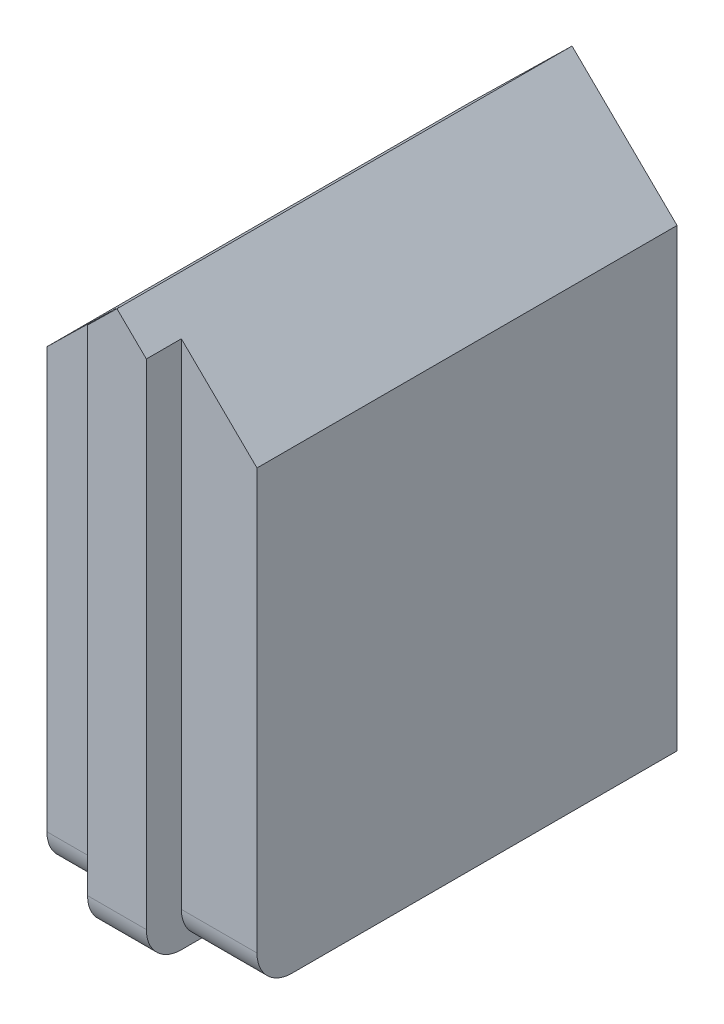
ISO-10303-21;
HEADER;
FILE_DESCRIPTION(('STEP AP214'),'2;1');
FILE_NAME('part.step','',(''),(''),'','','');
FILE_SCHEMA(('AUTOMOTIVE_DESIGN { 1 0 10303 214 1 1 1 1 }'));
ENDSEC;
DATA;
#1=APPLICATION_CONTEXT('core data for automotive mechanical design processes');
#2=APPLICATION_PROTOCOL_DEFINITION('international standard','automotive_design',2000,#1);
#3=PRODUCT_CONTEXT('',#1,'mechanical');
#4=PRODUCT('Part','Part','',(#3));
#5=PRODUCT_RELATED_PRODUCT_CATEGORY('part','',(#4));
#6=PRODUCT_DEFINITION_FORMATION('','',#4);
#7=PRODUCT_DEFINITION_CONTEXT('part definition',#1,'design');
#8=PRODUCT_DEFINITION('design','',#6,#7);
#9=PRODUCT_DEFINITION_SHAPE('','',#8);
#10=(LENGTH_UNIT() NAMED_UNIT(*) SI_UNIT(.MILLI.,.METRE.));
#11=(NAMED_UNIT(*) PLANE_ANGLE_UNIT() SI_UNIT($,.RADIAN.));
#12=(NAMED_UNIT(*) SI_UNIT($,.STERADIAN.) SOLID_ANGLE_UNIT());
#13=UNCERTAINTY_MEASURE_WITH_UNIT(LENGTH_MEASURE(1.E-05),#10,'distance_accuracy_value','');
#14=(GEOMETRIC_REPRESENTATION_CONTEXT(3) GLOBAL_UNCERTAINTY_ASSIGNED_CONTEXT((#13)) GLOBAL_UNIT_ASSIGNED_CONTEXT((#10,
#11,#12)) REPRESENTATION_CONTEXT('',''));
#15=CARTESIAN_POINT('',(0.,0.,0.));
#16=DIRECTION('',(0.,0.,1.));
#17=DIRECTION('',(1.,0.,0.));
#18=AXIS2_PLACEMENT_3D('',#15,#16,#17);
#19=CARTESIAN_POINT('',(3.,1.,12.));
#20=DIRECTION('',(1.,0.,0.));
#21=DIRECTION('',(0.,1.,0.));
#22=AXIS2_PLACEMENT_3D('',#19,#20,#21);
#23=CYLINDRICAL_SURFACE('',#22,1.);
#24=DIRECTION('',(1.,0.,0.));
#25=VECTOR('',#24,1.);
#26=CARTESIAN_POINT('',(3.,1.,13.));
#27=LINE('',#26,#25);
#28=CARTESIAN_POINT('',(2.16002824544881,1.,13.));
#29=VERTEX_POINT('',#28);
#30=CARTESIAN_POINT('',(3.83997175455118,1.,13.));
#31=VERTEX_POINT('',#30);
#32=EDGE_CURVE('E169',#29,#31,#27,.T.);
#33=ORIENTED_EDGE('',*,*,#32,.F.);
#34=CARTESIAN_POINT('',(2.16002824544881,1.,12.));
#35=DIRECTION('',(1.,0.,0.));
#36=DIRECTION('',(0.,0.,-1.));
#37=AXIS2_PLACEMENT_3D('',#34,#35,#36);
#38=CIRCLE('',#37,1.);
#39=CARTESIAN_POINT('',(2.16002824544881,0.,12.));
#40=VERTEX_POINT('',#39);
#41=EDGE_CURVE('E41',#40,#29,#38,.F.);
#42=ORIENTED_EDGE('',*,*,#41,.F.);
#43=DIRECTION('',(1.,0.,0.));
#44=VECTOR('',#43,1.);
#45=CARTESIAN_POINT('',(6.,0.,12.));
#46=LINE('',#45,#44);
#47=CARTESIAN_POINT('',(3.83997175455118,0.,12.));
#48=VERTEX_POINT('',#47);
#49=EDGE_CURVE('E172',#48,#40,#46,.F.);
#50=ORIENTED_EDGE('',*,*,#49,.F.);
#51=CARTESIAN_POINT('',(3.83997175455118,1.,12.));
#52=DIRECTION('',(-1.,0.,0.));
#53=DIRECTION('',(0.,0.,1.));
#54=AXIS2_PLACEMENT_3D('',#51,#52,#53);
#55=CIRCLE('',#54,1.);
#56=EDGE_CURVE('E11',#31,#48,#55,.F.);
#57=ORIENTED_EDGE('',*,*,#56,.F.);
#58=EDGE_LOOP('',(#33,#42,#50,#57));
#59=FACE_BOUND('',#58,.T.);
#60=ADVANCED_FACE('F34',(#59),#23,.T.);
#61=CARTESIAN_POINT('',(0.,1.,11.));
#62=DIRECTION('',(1.,0.,0.));
#63=DIRECTION('',(0.,1.,0.));
#64=AXIS2_PLACEMENT_3D('',#61,#62,#63);
#65=CYLINDRICAL_SURFACE('',#64,1.);
#66=DIRECTION('',(1.,0.,0.));
#67=VECTOR('',#66,1.);
#68=CARTESIAN_POINT('',(0.,1.,12.));
#69=LINE('',#68,#67);
#70=CARTESIAN_POINT('',(3.83997175455118,1.,12.));
#71=VERTEX_POINT('',#70);
#72=CARTESIAN_POINT('',(6.,1.,12.));
#73=VERTEX_POINT('',#72);
#74=EDGE_CURVE('E186',#71,#73,#69,.T.);
#75=ORIENTED_EDGE('',*,*,#74,.F.);
#76=CARTESIAN_POINT('',(3.83997175455118,1.,11.));
#77=DIRECTION('',(-1.,0.,0.));
#78=DIRECTION('',(0.,0.,1.));
#79=AXIS2_PLACEMENT_3D('',#76,#77,#78);
#80=CIRCLE('',#79,1.);
#81=CARTESIAN_POINT('',(3.83997175455118,0.,11.));
#82=VERTEX_POINT('',#81);
#83=EDGE_CURVE('E175',#71,#82,#80,.F.);
#84=ORIENTED_EDGE('',*,*,#83,.T.);
#85=DIRECTION('',(1.,0.,0.));
#86=VECTOR('',#85,1.);
#87=CARTESIAN_POINT('',(6.,0.,11.));
#88=LINE('',#87,#86);
#89=CARTESIAN_POINT('',(6.,0.,11.));
#90=VERTEX_POINT('',#89);
#91=EDGE_CURVE('E182',#90,#82,#88,.F.);
#92=ORIENTED_EDGE('',*,*,#91,.F.);
#93=CARTESIAN_POINT('',(6.,1.,11.));
#94=DIRECTION('',(-1.,0.,0.));
#95=DIRECTION('',(0.,-1.,0.));
#96=AXIS2_PLACEMENT_3D('',#93,#94,#95);
#97=CIRCLE('',#96,1.);
#98=EDGE_CURVE('E177',#73,#90,#97,.F.);
#99=ORIENTED_EDGE('',*,*,#98,.F.);
#100=EDGE_LOOP('',(#75,#84,#92,#99));
#101=FACE_BOUND('',#100,.T.);
#102=ADVANCED_FACE('F267',(#101),#65,.T.);
#103=CARTESIAN_POINT('',(0.,1.,11.));
#104=DIRECTION('',(1.,0.,0.));
#105=DIRECTION('',(0.,1.,0.));
#106=AXIS2_PLACEMENT_3D('',#103,#104,#105);
#107=CYLINDRICAL_SURFACE('',#106,1.);
#108=DIRECTION('',(1.,0.,0.));
#109=VECTOR('',#108,1.);
#110=CARTESIAN_POINT('',(0.,1.,12.));
#111=LINE('',#110,#109);
#112=CARTESIAN_POINT('',(0.,1.,12.));
#113=VERTEX_POINT('',#112);
#114=CARTESIAN_POINT('',(2.16002824544881,1.,12.));
#115=VERTEX_POINT('',#114);
#116=EDGE_CURVE('E165',#113,#115,#111,.T.);
#117=ORIENTED_EDGE('',*,*,#116,.F.);
#118=CARTESIAN_POINT('',(0.,1.,11.));
#119=DIRECTION('',(1.,0.,0.));
#120=DIRECTION('',(0.,1.,0.));
#121=AXIS2_PLACEMENT_3D('',#118,#119,#120);
#122=CIRCLE('',#121,1.);
#123=CARTESIAN_POINT('',(0.,0.,11.));
#124=VERTEX_POINT('',#123);
#125=EDGE_CURVE('E225',#124,#113,#122,.F.);
#126=ORIENTED_EDGE('',*,*,#125,.F.);
#127=DIRECTION('',(1.,0.,0.));
#128=VECTOR('',#127,1.);
#129=CARTESIAN_POINT('',(6.,0.,11.));
#130=LINE('',#129,#128);
#131=CARTESIAN_POINT('',(2.16002824544881,0.,11.));
#132=VERTEX_POINT('',#131);
#133=EDGE_CURVE('E223',#132,#124,#130,.F.);
#134=ORIENTED_EDGE('',*,*,#133,.F.);
#135=CARTESIAN_POINT('',(2.16002824544881,1.,11.));
#136=DIRECTION('',(1.,0.,0.));
#137=DIRECTION('',(0.,0.,-1.));
#138=AXIS2_PLACEMENT_3D('',#135,#136,#137);
#139=CIRCLE('',#138,1.);
#140=EDGE_CURVE('E189',#132,#115,#139,.F.);
#141=ORIENTED_EDGE('',*,*,#140,.T.);
#142=EDGE_LOOP('',(#117,#126,#134,#141));
#143=FACE_BOUND('',#142,.T.);
#144=ADVANCED_FACE('F269',(#143),#107,.T.);
#145=CARTESIAN_POINT('',(0.,0.,12.));
#146=DIRECTION('',(0.,0.,-1.));
#147=DIRECTION('',(-1.,0.,0.));
#148=AXIS2_PLACEMENT_3D('',#145,#146,#147);
#149=PLANE('',#148);
#150=DIRECTION('',(0.,1.,0.));
#151=VECTOR('',#150,1.);
#152=CARTESIAN_POINT('',(3.83997175455118,0.,12.));
#153=LINE('',#152,#151);
#154=CARTESIAN_POINT('',(3.83997175455118,15.1163868125395,12.));
#155=VERTEX_POINT('',#154);
#156=EDGE_CURVE('E138',#71,#155,#153,.T.);
#157=ORIENTED_EDGE('',*,*,#156,.F.);
#158=ORIENTED_EDGE('',*,*,#74,.T.);
#159=DIRECTION('',(0.,1.,0.));
#160=VECTOR('',#159,1.);
#161=CARTESIAN_POINT('',(6.,13.,12.));
#162=LINE('',#161,#160);
#163=CARTESIAN_POINT('',(6.,13.,12.));
#164=VERTEX_POINT('',#163);
#165=EDGE_CURVE('E199',#73,#164,#162,.T.);
#166=ORIENTED_EDGE('',*,*,#165,.T.);
#167=DIRECTION('',(-0.714285714285715,0.699854212223765,0.));
#168=VECTOR('',#167,1.);
#169=CARTESIAN_POINT('',(3.,15.9393876913398,12.));
#170=LINE('',#169,#168);
#171=EDGE_CURVE('E201',#164,#155,#170,.T.);
#172=ORIENTED_EDGE('',*,*,#171,.T.);
#173=EDGE_LOOP('',(#157,#158,#166,#172));
#174=FACE_BOUND('',#173,.T.);
#175=ADVANCED_FACE('F266',(#174),#149,.F.);
#176=DIRECTION('',(0.,-1.,0.));
#177=VECTOR('',#176,1.);
#178=CARTESIAN_POINT('',(0.,0.,12.));
#179=LINE('',#178,#177);
#180=CARTESIAN_POINT('',(0.,13.,12.));
#181=VERTEX_POINT('',#180);
#182=EDGE_CURVE('E213',#181,#113,#179,.T.);
#183=ORIENTED_EDGE('',*,*,#182,.T.);
#184=ORIENTED_EDGE('',*,*,#116,.T.);
#185=DIRECTION('',(0.,-1.,0.));
#186=VECTOR('',#185,1.);
#187=CARTESIAN_POINT('',(2.16002824544881,15.1163868125395,12.));
#188=LINE('',#187,#186);
#189=CARTESIAN_POINT('',(2.16002824544882,15.1163868125395,12.));
#190=VERTEX_POINT('',#189);
#191=EDGE_CURVE('E192',#190,#115,#188,.T.);
#192=ORIENTED_EDGE('',*,*,#191,.F.);
#193=DIRECTION('',(-0.714285714285715,-0.699854212223765,0.));
#194=VECTOR('',#193,1.);
#195=CARTESIAN_POINT('',(0.,13.,12.));
#196=LINE('',#195,#194);
#197=EDGE_CURVE('E143',#190,#181,#196,.T.);
#198=ORIENTED_EDGE('',*,*,#197,.T.);
#199=EDGE_LOOP('',(#183,#184,#192,#198));
#200=FACE_BOUND('',#199,.T.);
#201=ADVANCED_FACE('F219',(#200),#149,.F.);
#202=CARTESIAN_POINT('',(6.,0.,12.));
#203=DIRECTION('',(0.,1.,0.));
#204=DIRECTION('',(-1.,0.,0.));
#205=AXIS2_PLACEMENT_3D('',#202,#203,#204);
#206=PLANE('',#205);
#207=DIRECTION('',(0.,0.,-1.));
#208=VECTOR('',#207,1.);
#209=CARTESIAN_POINT('',(3.83997175455118,0.,13.));
#210=LINE('',#209,#208);
#211=EDGE_CURVE('E150',#48,#82,#210,.T.);
#212=ORIENTED_EDGE('',*,*,#211,.F.);
#213=ORIENTED_EDGE('',*,*,#49,.T.);
#214=DIRECTION('',(0.,0.,-1.));
#215=VECTOR('',#214,1.);
#216=CARTESIAN_POINT('',(2.16002824544881,0.,13.));
#217=LINE('',#216,#215);
#218=EDGE_CURVE('E145',#40,#132,#217,.T.);
#219=ORIENTED_EDGE('',*,*,#218,.T.);
#220=ORIENTED_EDGE('',*,*,#133,.T.);
#221=DIRECTION('',(0.,0.,-1.));
#222=VECTOR('',#221,1.);
#223=CARTESIAN_POINT('',(0.,0.,12.));
#224=LINE('',#223,#222);
#225=CARTESIAN_POINT('',(0.,0.,0.));
#226=VERTEX_POINT('',#225);
#227=EDGE_CURVE('E241',#124,#226,#224,.T.);
#228=ORIENTED_EDGE('',*,*,#227,.T.);
#229=DIRECTION('',(1.,0.,0.));
#230=VECTOR('',#229,1.);
#231=CARTESIAN_POINT('',(6.,0.,0.));
#232=LINE('',#231,#230);
#233=CARTESIAN_POINT('',(6.,0.,0.));
#234=VERTEX_POINT('',#233);
#235=EDGE_CURVE('E144',#226,#234,#232,.T.);
#236=ORIENTED_EDGE('',*,*,#235,.T.);
#237=DIRECTION('',(0.,0.,-1.));
#238=VECTOR('',#237,1.);
#239=CARTESIAN_POINT('',(6.,0.,12.));
#240=LINE('',#239,#238);
#241=EDGE_CURVE('E211',#90,#234,#240,.T.);
#242=ORIENTED_EDGE('',*,*,#241,.F.);
#243=ORIENTED_EDGE('',*,*,#91,.T.);
#244=EDGE_LOOP('',(#212,#213,#219,#220,#228,#236,#242,#243));
#245=FACE_BOUND('',#244,.T.);
#246=ADVANCED_FACE('F256',(#245),#206,.F.);
#247=CARTESIAN_POINT('',(6.,13.,12.));
#248=DIRECTION('',(-1.,0.,0.));
#249=DIRECTION('',(0.,-1.,0.));
#250=AXIS2_PLACEMENT_3D('',#247,#248,#249);
#251=PLANE('',#250);
#252=ORIENTED_EDGE('',*,*,#165,.F.);
#253=ORIENTED_EDGE('',*,*,#98,.T.);
#254=ORIENTED_EDGE('',*,*,#241,.T.);
#255=DIRECTION('',(0.,1.,0.));
#256=VECTOR('',#255,1.);
#257=CARTESIAN_POINT('',(6.,13.,0.));
#258=LINE('',#257,#256);
#259=CARTESIAN_POINT('',(6.,13.,0.));
#260=VERTEX_POINT('',#259);
#261=EDGE_CURVE('E148',#234,#260,#258,.T.);
#262=ORIENTED_EDGE('',*,*,#261,.T.);
#263=DIRECTION('',(0.,0.,-1.));
#264=VECTOR('',#263,1.);
#265=CARTESIAN_POINT('',(6.,13.,12.));
#266=LINE('',#265,#264);
#267=EDGE_CURVE('E226',#164,#260,#266,.T.);
#268=ORIENTED_EDGE('',*,*,#267,.F.);
#269=EDGE_LOOP('',(#252,#253,#254,#262,#268));
#270=FACE_BOUND('',#269,.T.);
#271=ADVANCED_FACE('F250',(#270),#251,.F.);
#272=CARTESIAN_POINT('',(3.,15.9393876913398,12.));
#273=DIRECTION('',(-0.699854212223765,-0.714285714285715,0.));
#274=DIRECTION('',(0.714285714285715,-0.699854212223765,0.));
#275=AXIS2_PLACEMENT_3D('',#272,#273,#274);
#276=PLANE('',#275);
#277=DIRECTION('',(-0.714285714285715,0.699854212223765,0.));
#278=VECTOR('',#277,1.);
#279=CARTESIAN_POINT('',(3.,15.9393876913398,0.));
#280=LINE('',#279,#278);
#281=CARTESIAN_POINT('',(3.,15.9393876913398,0.));
#282=VERTEX_POINT('',#281);
#283=EDGE_CURVE('E247',#260,#282,#280,.T.);
#284=ORIENTED_EDGE('',*,*,#283,.T.);
#285=DIRECTION('',(0.,0.,-1.));
#286=VECTOR('',#285,1.);
#287=CARTESIAN_POINT('',(3.,15.9393876913398,12.));
#288=LINE('',#287,#286);
#289=CARTESIAN_POINT('',(3.,15.9393876913398,13.));
#290=VERTEX_POINT('',#289);
#291=EDGE_CURVE('E231',#290,#282,#288,.T.);
#292=ORIENTED_EDGE('',*,*,#291,.F.);
#293=DIRECTION('',(-0.714285714285714,0.699854212223765,0.));
#294=VECTOR('',#293,1.);
#295=CARTESIAN_POINT('',(3.83997175455118,15.1163868125395,13.));
#296=LINE('',#295,#294);
#297=CARTESIAN_POINT('',(3.83997175455118,15.1163868125395,13.));
#298=VERTEX_POINT('',#297);
#299=EDGE_CURVE('E135',#298,#290,#296,.T.);
#300=ORIENTED_EDGE('',*,*,#299,.F.);
#301=DIRECTION('',(0.,0.,-1.));
#302=VECTOR('',#301,1.);
#303=CARTESIAN_POINT('',(3.83997175455118,15.1163868125395,13.));
#304=LINE('',#303,#302);
#305=EDGE_CURVE('E158',#298,#155,#304,.T.);
#306=ORIENTED_EDGE('',*,*,#305,.T.);
#307=ORIENTED_EDGE('',*,*,#171,.F.);
#308=ORIENTED_EDGE('',*,*,#267,.T.);
#309=EDGE_LOOP('',(#284,#292,#300,#306,#307,#308));
#310=FACE_BOUND('',#309,.T.);
#311=ADVANCED_FACE('F260',(#310),#276,.F.);
#312=CARTESIAN_POINT('',(0.,13.,12.));
#313=DIRECTION('',(0.699854212223765,-0.714285714285714,0.));
#314=DIRECTION('',(0.714285714285715,0.699854212223765,0.));
#315=AXIS2_PLACEMENT_3D('',#312,#313,#314);
#316=PLANE('',#315);
#317=DIRECTION('',(-0.714285714285715,-0.699854212223765,0.));
#318=VECTOR('',#317,1.);
#319=CARTESIAN_POINT('',(0.,13.,0.));
#320=LINE('',#319,#318);
#321=CARTESIAN_POINT('',(0.,13.,0.));
#322=VERTEX_POINT('',#321);
#323=EDGE_CURVE('E245',#282,#322,#320,.T.);
#324=ORIENTED_EDGE('',*,*,#323,.T.);
#325=DIRECTION('',(0.,0.,-1.));
#326=VECTOR('',#325,1.);
#327=CARTESIAN_POINT('',(0.,13.,12.));
#328=LINE('',#327,#326);
#329=EDGE_CURVE('E236',#181,#322,#328,.T.);
#330=ORIENTED_EDGE('',*,*,#329,.F.);
#331=ORIENTED_EDGE('',*,*,#197,.F.);
#332=DIRECTION('',(0.,0.,-1.));
#333=VECTOR('',#332,1.);
#334=CARTESIAN_POINT('',(2.16002824544881,15.1163868125395,13.));
#335=LINE('',#334,#333);
#336=CARTESIAN_POINT('',(2.16002824544881,15.1163868125395,13.));
#337=VERTEX_POINT('',#336);
#338=EDGE_CURVE('E125',#337,#190,#335,.T.);
#339=ORIENTED_EDGE('',*,*,#338,.F.);
#340=DIRECTION('',(-0.714285714285715,-0.699854212223764,0.));
#341=VECTOR('',#340,1.);
#342=CARTESIAN_POINT('',(3.,15.9393876913398,13.));
#343=LINE('',#342,#341);
#344=EDGE_CURVE('E129',#290,#337,#343,.T.);
#345=ORIENTED_EDGE('',*,*,#344,.F.);
#346=ORIENTED_EDGE('',*,*,#291,.T.);
#347=EDGE_LOOP('',(#324,#330,#331,#339,#345,#346));
#348=FACE_BOUND('',#347,.T.);
#349=ADVANCED_FACE('F141',(#348),#316,.F.);
#350=CARTESIAN_POINT('',(0.,0.,12.));
#351=DIRECTION('',(1.,0.,0.));
#352=DIRECTION('',(0.,1.,0.));
#353=AXIS2_PLACEMENT_3D('',#350,#351,#352);
#354=PLANE('',#353);
#355=ORIENTED_EDGE('',*,*,#227,.F.);
#356=ORIENTED_EDGE('',*,*,#125,.T.);
#357=ORIENTED_EDGE('',*,*,#182,.F.);
#358=ORIENTED_EDGE('',*,*,#329,.T.);
#359=DIRECTION('',(0.,-1.,0.));
#360=VECTOR('',#359,1.);
#361=CARTESIAN_POINT('',(0.,0.,0.));
#362=LINE('',#361,#360);
#363=EDGE_CURVE('E202',#322,#226,#362,.T.);
#364=ORIENTED_EDGE('',*,*,#363,.T.);
#365=EDGE_LOOP('',(#355,#356,#357,#358,#364));
#366=FACE_BOUND('',#365,.T.);
#367=ADVANCED_FACE('F259',(#366),#354,.F.);
#368=CARTESIAN_POINT('',(0.,0.,0.));
#369=DIRECTION('',(0.,0.,-1.));
#370=DIRECTION('',(-1.,0.,0.));
#371=AXIS2_PLACEMENT_3D('',#368,#369,#370);
#372=PLANE('',#371);
#373=ORIENTED_EDGE('',*,*,#235,.F.);
#374=ORIENTED_EDGE('',*,*,#363,.F.);
#375=ORIENTED_EDGE('',*,*,#323,.F.);
#376=ORIENTED_EDGE('',*,*,#283,.F.);
#377=ORIENTED_EDGE('',*,*,#261,.F.);
#378=EDGE_LOOP('',(#373,#374,#375,#376,#377));
#379=FACE_BOUND('',#378,.T.);
#380=ADVANCED_FACE('F253',(#379),#372,.T.);
#381=CARTESIAN_POINT('',(2.16002824544881,15.1163868125395,13.));
#382=DIRECTION('',(1.,0.,0.));
#383=DIRECTION('',(0.,0.,-1.));
#384=AXIS2_PLACEMENT_3D('',#381,#382,#383);
#385=PLANE('',#384);
#386=ORIENTED_EDGE('',*,*,#218,.F.);
#387=ORIENTED_EDGE('',*,*,#41,.T.);
#388=DIRECTION('',(0.,-1.,0.));
#389=VECTOR('',#388,1.);
#390=CARTESIAN_POINT('',(2.16002824544881,15.1163868125395,13.));
#391=LINE('',#390,#389);
#392=EDGE_CURVE('E119',#337,#29,#391,.T.);
#393=ORIENTED_EDGE('',*,*,#392,.F.);
#394=ORIENTED_EDGE('',*,*,#338,.T.);
#395=ORIENTED_EDGE('',*,*,#191,.T.);
#396=ORIENTED_EDGE('',*,*,#140,.F.);
#397=EDGE_LOOP('',(#386,#387,#393,#394,#395,#396));
#398=FACE_BOUND('',#397,.T.);
#399=ADVANCED_FACE('F122',(#398),#385,.F.);
#400=CARTESIAN_POINT('',(3.83997175455118,0.,13.));
#401=DIRECTION('',(-1.,0.,0.));
#402=DIRECTION('',(0.,0.,1.));
#403=AXIS2_PLACEMENT_3D('',#400,#401,#402);
#404=PLANE('',#403);
#405=DIRECTION('',(0.,1.,0.));
#406=VECTOR('',#405,1.);
#407=CARTESIAN_POINT('',(3.83997175455118,0.,13.));
#408=LINE('',#407,#406);
#409=EDGE_CURVE('E128',#31,#298,#408,.T.);
#410=ORIENTED_EDGE('',*,*,#409,.F.);
#411=ORIENTED_EDGE('',*,*,#56,.T.);
#412=ORIENTED_EDGE('',*,*,#211,.T.);
#413=ORIENTED_EDGE('',*,*,#83,.F.);
#414=ORIENTED_EDGE('',*,*,#156,.T.);
#415=ORIENTED_EDGE('',*,*,#305,.F.);
#416=EDGE_LOOP('',(#410,#411,#412,#413,#414,#415));
#417=FACE_BOUND('',#416,.T.);
#418=ADVANCED_FACE('F263',(#417),#404,.F.);
#419=CARTESIAN_POINT('',(3.,15.9393876913398,13.));
#420=DIRECTION('',(0.,0.,-1.));
#421=DIRECTION('',(-1.,0.,0.));
#422=AXIS2_PLACEMENT_3D('',#419,#420,#421);
#423=PLANE('',#422);
#424=ORIENTED_EDGE('',*,*,#392,.T.);
#425=ORIENTED_EDGE('',*,*,#32,.T.);
#426=ORIENTED_EDGE('',*,*,#409,.T.);
#427=ORIENTED_EDGE('',*,*,#299,.T.);
#428=ORIENTED_EDGE('',*,*,#344,.T.);
#429=EDGE_LOOP('',(#424,#425,#426,#427,#428));
#430=FACE_BOUND('',#429,.T.);
#431=ADVANCED_FACE('F133',(#430),#423,.F.);
#432=CLOSED_SHELL('',(#60,#102,#144,#175,#201,#246,#271,#311,#349,#367,#380,#399,#418,#431));
#433=MANIFOLD_SOLID_BREP('B2',#432);
#434=ADVANCED_BREP_SHAPE_REPRESENTATION('',(#18,#433),#14);
#435=SHAPE_DEFINITION_REPRESENTATION(#9,#434);
ENDSEC;
END-ISO-10303-21;
